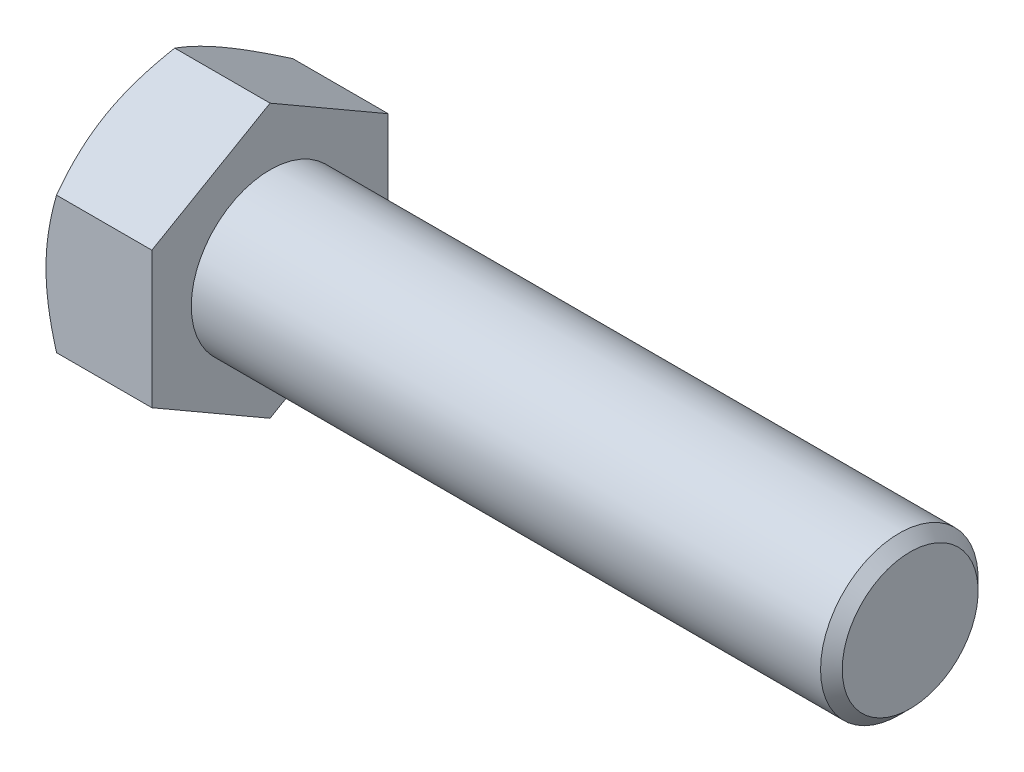
ISO-10303-21;
HEADER;
FILE_DESCRIPTION(('STEP AP214'),'2;1');
FILE_NAME('part.step','',(''),(''),'','','');
FILE_SCHEMA(('AUTOMOTIVE_DESIGN { 1 0 10303 214 1 1 1 1 }'));
ENDSEC;
DATA;
#1=APPLICATION_CONTEXT('core data for automotive mechanical design processes');
#2=APPLICATION_PROTOCOL_DEFINITION('international standard','automotive_design',2000,#1);
#3=PRODUCT_CONTEXT('',#1,'mechanical');
#4=PRODUCT('Part','Part','',(#3));
#5=PRODUCT_RELATED_PRODUCT_CATEGORY('part','',(#4));
#6=PRODUCT_DEFINITION_FORMATION('','',#4);
#7=PRODUCT_DEFINITION_CONTEXT('part definition',#1,'design');
#8=PRODUCT_DEFINITION('design','',#6,#7);
#9=PRODUCT_DEFINITION_SHAPE('','',#8);
#10=(LENGTH_UNIT() NAMED_UNIT(*) SI_UNIT(.MILLI.,.METRE.));
#11=(NAMED_UNIT(*) PLANE_ANGLE_UNIT() SI_UNIT($,.RADIAN.));
#12=(NAMED_UNIT(*) SI_UNIT($,.STERADIAN.) SOLID_ANGLE_UNIT());
#13=UNCERTAINTY_MEASURE_WITH_UNIT(LENGTH_MEASURE(1.E-05),#10,'distance_accuracy_value','');
#14=(GEOMETRIC_REPRESENTATION_CONTEXT(3) GLOBAL_UNCERTAINTY_ASSIGNED_CONTEXT((#13)) GLOBAL_UNIT_ASSIGNED_CONTEXT((#10,
#11,#12)) REPRESENTATION_CONTEXT('',''));
#15=CARTESIAN_POINT('',(0.,0.,0.));
#16=DIRECTION('',(0.,0.,1.));
#17=DIRECTION('',(1.,0.,0.));
#18=AXIS2_PLACEMENT_3D('',#15,#16,#17);
#19=CARTESIAN_POINT('',(0.,13.856406460551,0.));
#20=DIRECTION('',(1.,0.,0.));
#21=DIRECTION('',(0.,0.,-1.));
#22=AXIS2_PLACEMENT_3D('',#19,#20,#21);
#23=PLANE('',#22);
#24=CARTESIAN_POINT('',(0.,0.,0.));
#25=DIRECTION('',(1.,0.,0.));
#26=DIRECTION('',(0.,0.,-1.));
#27=AXIS2_PLACEMENT_3D('',#24,#25,#26);
#28=CIRCLE('',#27,12.);
#29=CARTESIAN_POINT('',(0.,-10.3923048454133,-6.));
#30=VERTEX_POINT('',#29);
#31=CARTESIAN_POINT('',(0.,0.,-12.));
#32=VERTEX_POINT('',#31);
#33=EDGE_CURVE('E328',#30,#32,#28,.T.);
#34=ORIENTED_EDGE('',*,*,#33,.F.);
#35=CARTESIAN_POINT('',(0.,0.,0.));
#36=DIRECTION('',(1.,0.,0.));
#37=DIRECTION('',(0.,0.,-1.));
#38=AXIS2_PLACEMENT_3D('',#35,#36,#37);
#39=CIRCLE('',#38,12.);
#40=CARTESIAN_POINT('',(0.,-10.3923048454132,6.00000000000003));
#41=VERTEX_POINT('',#40);
#42=EDGE_CURVE('E327',#41,#30,#39,.T.);
#43=ORIENTED_EDGE('',*,*,#42,.F.);
#44=CARTESIAN_POINT('',(0.,0.,0.));
#45=DIRECTION('',(1.,0.,0.));
#46=DIRECTION('',(0.,0.,-1.));
#47=AXIS2_PLACEMENT_3D('',#44,#45,#46);
#48=CIRCLE('',#47,12.);
#49=CARTESIAN_POINT('',(0.,0.,12.));
#50=VERTEX_POINT('',#49);
#51=EDGE_CURVE('E89',#50,#41,#48,.T.);
#52=ORIENTED_EDGE('',*,*,#51,.F.);
#53=CARTESIAN_POINT('',(0.,0.,0.));
#54=DIRECTION('',(1.,0.,0.));
#55=DIRECTION('',(0.,0.,-1.));
#56=AXIS2_PLACEMENT_3D('',#53,#54,#55);
#57=CIRCLE('',#56,12.);
#58=CARTESIAN_POINT('',(0.,10.3923048454133,6.00000000000001));
#59=VERTEX_POINT('',#58);
#60=EDGE_CURVE('E87',#59,#50,#57,.T.);
#61=ORIENTED_EDGE('',*,*,#60,.F.);
#62=CARTESIAN_POINT('',(0.,0.,0.));
#63=DIRECTION('',(1.,0.,0.));
#64=DIRECTION('',(0.,0.,-1.));
#65=AXIS2_PLACEMENT_3D('',#62,#63,#64);
#66=CIRCLE('',#65,12.);
#67=CARTESIAN_POINT('',(0.,10.3923048454133,-6.00000000000001));
#68=VERTEX_POINT('',#67);
#69=EDGE_CURVE('E20',#68,#59,#66,.T.);
#70=ORIENTED_EDGE('',*,*,#69,.F.);
#71=CARTESIAN_POINT('',(0.,0.,0.));
#72=DIRECTION('',(1.,0.,0.));
#73=DIRECTION('',(0.,0.,-1.));
#74=AXIS2_PLACEMENT_3D('',#71,#72,#73);
#75=CIRCLE('',#74,12.);
#76=EDGE_CURVE('E255',#32,#68,#75,.T.);
#77=ORIENTED_EDGE('',*,*,#76,.F.);
#78=EDGE_LOOP('',(#34,#43,#52,#61,#70,#77));
#79=FACE_BOUND('',#78,.T.);
#80=ADVANCED_FACE('F17',(#79),#23,.F.);
#81=CARTESIAN_POINT('',(1.07822755034284,0.,0.));
#82=DIRECTION('',(1.,0.,0.));
#83=DIRECTION('',(0.,0.,-1.));
#84=AXIS2_PLACEMENT_3D('',#81,#82,#83);
#85=CONICAL_SURFACE('',#84,13.8675448993143,1.0471975511966);
#86=CARTESIAN_POINT('',(1.07179676972449,13.856406460551,0.));
#87=CARTESIAN_POINT('',(0.908940799911312,13.5743006175821,-0.488621653134199));
#88=CARTESIAN_POINT('',(0.759755266933871,13.2901242461885,-0.980829566698534));
#89=CARTESIAN_POINT('',(0.562274952239644,12.8616146811394,-1.72302990489287));
#90=CARTESIAN_POINT('',(0.50095006831841,12.7187583400199,-1.97046434589519));
#91=CARTESIAN_POINT('',(0.387776318757365,12.4321091330912,-2.46695533624495));
#92=CARTESIAN_POINT('',(0.335926875709029,12.2883163249013,-2.71601178579294));
#93=CARTESIAN_POINT('',(0.242530246242278,11.9997152642606,-3.21588348594086));
#94=CARTESIAN_POINT('',(0.200995561015241,11.8549059962408,-3.46670049555793));
#95=CARTESIAN_POINT('',(0.129101019121795,11.5645948484026,-3.96953415361745));
#96=CARTESIAN_POINT('',(0.0987408683331393,11.4190929869158,-4.22155077030845));
#97=CARTESIAN_POINT('',(0.0497242910385115,11.1268576505267,-4.72771722070131));
#98=CARTESIAN_POINT('',(0.0311273829961276,10.9801216596432,-4.98187141221056));
#99=CARTESIAN_POINT('',(0.00623934431726279,10.6863610957437,-5.49067963414449));
#100=CARTESIAN_POINT('',(-4.93491989073702E-05,10.539336471344,-5.74533375356847));
#101=CARTESIAN_POINT('',(0.,10.3923048454133,-6.00000000000001));
#102=B_SPLINE_CURVE_WITH_KNOTS('',3,(#86,#87,#88,#89,#90,#91,#92,#93,#94,#95,#96,#97,#98,#99,
#100,#101),.UNSPECIFIED.,.F.,.F.,(4,2,2,2,2,2,2,4),(0.,1.76168798013763,2.63822760396066,
3.5147137959332,4.39225713601218,5.26977737683081,6.15170281893047,7.03380287133137),.UNSPECIFIED.);
#103=CARTESIAN_POINT('',(1.07179676972449,13.856406460551,0.));
#104=VERTEX_POINT('',#103);
#105=EDGE_CURVE('E99',#104,#68,#102,.T.);
#106=ORIENTED_EDGE('',*,*,#105,.T.);
#107=ORIENTED_EDGE('',*,*,#69,.T.);
#108=CARTESIAN_POINT('',(0.,10.3923048454133,6.00000000000001));
#109=CARTESIAN_POINT('',(-4.93491989066502E-05,10.539336471344,5.74533375356847));
#110=CARTESIAN_POINT('',(0.00623934431726331,10.6863610957437,5.49067963414449));
#111=CARTESIAN_POINT('',(0.0311273829961284,10.9801216596432,4.98187141221056));
#112=CARTESIAN_POINT('',(0.0497242910385127,11.1268576505267,4.72771722070131));
#113=CARTESIAN_POINT('',(0.0987408683331407,11.4190929869158,4.22155077030845));
#114=CARTESIAN_POINT('',(0.129101019121797,11.5645948484026,3.96953415361745));
#115=CARTESIAN_POINT('',(0.200995561015241,11.8549059962408,3.46670049555793));
#116=CARTESIAN_POINT('',(0.242530246242278,11.9997152642606,3.21588348594086));
#117=CARTESIAN_POINT('',(0.33592687570903,12.2883163249013,2.71601178579294));
#118=CARTESIAN_POINT('',(0.387776318757366,12.4321091330912,2.46695533624495));
#119=CARTESIAN_POINT('',(0.500950068318412,12.7187583400199,1.97046434589519));
#120=CARTESIAN_POINT('',(0.562274952239646,12.8616146811394,1.72302990489287));
#121=CARTESIAN_POINT('',(0.75975526693387,13.2901242461885,0.980829566698535));
#122=CARTESIAN_POINT('',(0.90894079991131,13.5743006175821,0.4886216531342));
#123=CARTESIAN_POINT('',(1.07179676972449,13.856406460551,0.));
#124=B_SPLINE_CURVE_WITH_KNOTS('',3,(#108,#109,#110,#111,#112,#113,#114,#115,#116,#117,#118,
#119,#120,#121,#122,#123),.UNSPECIFIED.,.F.,.F.,(4,2,2,2,2,2,2,4),(0.,0.882100052400904,
1.76402549450056,2.64154573531919,3.51908907539817,4.39557526737071,5.27211489119374,
7.03380287133137),.UNSPECIFIED.);
#125=EDGE_CURVE('E97',#59,#104,#124,.T.);
#126=ORIENTED_EDGE('',*,*,#125,.T.);
#127=EDGE_LOOP('',(#106,#107,#126));
#128=FACE_BOUND('',#127,.T.);
#129=ADVANCED_FACE('F95',(#128),#85,.T.);
#130=CARTESIAN_POINT('',(1.07822755034283,0.,0.));
#131=DIRECTION('',(1.,0.,0.));
#132=DIRECTION('',(0.,0.,-1.));
#133=AXIS2_PLACEMENT_3D('',#130,#131,#132);
#134=CONICAL_SURFACE('',#133,13.8675448993143,1.0471975511966);
#135=CARTESIAN_POINT('',(1.07179676972448,6.9282032302755,12.));
#136=CARTESIAN_POINT('',(0.908940799911304,7.21030907324441,11.5113783468658));
#137=CARTESIAN_POINT('',(0.759755266933865,7.49448544463804,11.0191704333015));
#138=CARTESIAN_POINT('',(0.562274952239641,7.92299500968717,10.2769700951071));
#139=CARTESIAN_POINT('',(0.500950068318407,8.06585135080665,10.0295356541048));
#140=CARTESIAN_POINT('',(0.387776318757363,8.3525005577353,9.53304466375506));
#141=CARTESIAN_POINT('',(0.335926875709027,8.49629336592525,9.28398821420708));
#142=CARTESIAN_POINT('',(0.242530246242276,8.78489442656593,8.78411651405915));
#143=CARTESIAN_POINT('',(0.200995561015239,8.92970369458568,8.53329950444208));
#144=CARTESIAN_POINT('',(0.129101019121795,9.22001484242395,8.03046584638256));
#145=CARTESIAN_POINT('',(0.0987408683331404,9.36551670391075,7.77844922969157));
#146=CARTESIAN_POINT('',(0.0497242910385134,9.65775204029983,7.27228277929871));
#147=CARTESIAN_POINT('',(0.0311273829961288,9.80448803118336,7.01812858778946));
#148=CARTESIAN_POINT('',(0.00623934431726292,10.0982485950828,6.50932036585553));
#149=CARTESIAN_POINT('',(-4.93491989074931E-05,10.2452732194825,6.25466624643155));
#150=CARTESIAN_POINT('',(0.,10.3923048454133,6.00000000000001));
#151=B_SPLINE_CURVE_WITH_KNOTS('',3,(#135,#136,#137,#138,#139,#140,#141,#142,#143,#144,#145,
#146,#147,#148,#149,#150),.UNSPECIFIED.,.F.,.F.,(4,2,2,2,2,2,2,4),(0.,1.76168798013762,
2.63822760396065,3.51471379593319,4.39225713601216,5.26977737683078,6.15170281893044,
7.03380287133134),.UNSPECIFIED.);
#152=CARTESIAN_POINT('',(1.07179676972448,6.9282032302755,12.));
#153=VERTEX_POINT('',#152);
#154=EDGE_CURVE('E102',#153,#59,#151,.T.);
#155=ORIENTED_EDGE('',*,*,#154,.T.);
#156=ORIENTED_EDGE('',*,*,#60,.T.);
#157=CARTESIAN_POINT('',(0.,0.,12.));
#158=CARTESIAN_POINT('',(-4.93491989069261E-05,0.294063251861521,12.));
#159=CARTESIAN_POINT('',(0.00623934431726302,0.588112500660887,12.));
#160=CARTESIAN_POINT('',(0.0311273829961276,1.17563362845979,12.));
#161=CARTESIAN_POINT('',(0.0497242910385114,1.46910561022685,12.));
#162=CARTESIAN_POINT('',(0.0987408683331387,2.05357628300501,12.));
#163=CARTESIAN_POINT('',(0.129101019121794,2.34458000597862,12.));
#164=CARTESIAN_POINT('',(0.200995561015239,2.92520230165515,12.));
#165=CARTESIAN_POINT('',(0.242530246242275,3.21482083769466,12.));
#166=CARTESIAN_POINT('',(0.335926875709026,3.79202295897601,12.));
#167=CARTESIAN_POINT('',(0.387776318757362,4.0796085753559,12.));
#168=CARTESIAN_POINT('',(0.500950068318406,4.65290698921321,12.));
#169=CARTESIAN_POINT('',(0.56227495223964,4.93861967145216,12.));
#170=CARTESIAN_POINT('',(0.759755266933863,5.79563880155042,12.));
#171=CARTESIAN_POINT('',(0.908940799911302,6.36399154433768,12.));
#172=CARTESIAN_POINT('',(1.07179676972448,6.9282032302755,12.));
#173=B_SPLINE_CURVE_WITH_KNOTS('',3,(#157,#158,#159,#160,#161,#162,#163,#164,#165,#166,#167,
#168,#169,#170,#171,#172),.UNSPECIFIED.,.F.,.F.,(4,2,2,2,2,2,2,4),(0.,0.8821000524009,
1.76402549450056,2.64154573531918,3.51908907539815,4.39557526737069,5.27211489119372,
7.03380287133134),.UNSPECIFIED.);
#174=EDGE_CURVE('E105',#50,#153,#173,.T.);
#175=ORIENTED_EDGE('',*,*,#174,.T.);
#176=EDGE_LOOP('',(#155,#156,#175));
#177=FACE_BOUND('',#176,.T.);
#178=ADVANCED_FACE('F103',(#177),#134,.T.);
#179=CARTESIAN_POINT('',(1.07822755034282,0.,0.));
#180=DIRECTION('',(1.,0.,0.));
#181=DIRECTION('',(0.,0.,-1.));
#182=AXIS2_PLACEMENT_3D('',#179,#180,#181);
#183=CONICAL_SURFACE('',#182,13.8675448993143,1.0471975511966);
#184=ORIENTED_EDGE('',*,*,#51,.T.);
#185=CARTESIAN_POINT('',(0.,-10.3923048454132,6.00000000000002));
#186=CARTESIAN_POINT('',(-4.93491989117504E-05,-10.2452732194825,6.25466624643156));
#187=CARTESIAN_POINT('',(0.0062393443172584,-10.0982485950828,6.50932036585554));
#188=CARTESIAN_POINT('',(0.0311273829961234,-9.80448803118335,7.01812858778947));
#189=CARTESIAN_POINT('',(0.0497242910385074,-9.65775204029981,7.27228277929872));
#190=CARTESIAN_POINT('',(0.0987408683331346,-9.36551670391073,7.77844922969158));
#191=CARTESIAN_POINT('',(0.12910101912179,-9.22001484242393,8.03046584638257));
#192=CARTESIAN_POINT('',(0.200995561015234,-8.92970369458566,8.53329950444209));
#193=CARTESIAN_POINT('',(0.242530246242271,-8.78489442656591,8.78411651405916));
#194=CARTESIAN_POINT('',(0.335926875709021,-8.49629336592523,9.28398821420708));
#195=CARTESIAN_POINT('',(0.387776318757357,-8.35250055773529,9.53304466375507));
#196=CARTESIAN_POINT('',(0.500950068318402,-8.06585135080663,10.0295356541048));
#197=CARTESIAN_POINT('',(0.562274952239635,-7.92299500968716,10.2769700951071));
#198=CARTESIAN_POINT('',(0.759755266933859,-7.49448544463803,11.0191704333015));
#199=CARTESIAN_POINT('',(0.908940799911297,-7.21030907324439,11.5113783468658));
#200=CARTESIAN_POINT('',(1.07179676972448,-6.92820323027548,12.));
#201=B_SPLINE_CURVE_WITH_KNOTS('',3,(#185,#186,#187,#188,#189,#190,#191,#192,#193,#194,#195,
#196,#197,#198,#199,#200),.UNSPECIFIED.,.F.,.F.,(4,2,2,2,2,2,2,4),(0.,0.882100052400899,
1.76402549450056,2.64154573531917,3.51908907539815,4.39557526737069,5.27211489119371,
7.03380287133133),.UNSPECIFIED.);
#202=CARTESIAN_POINT('',(1.07179676972448,-6.92820323027548,12.));
#203=VERTEX_POINT('',#202);
#204=EDGE_CURVE('E174',#41,#203,#201,.T.);
#205=ORIENTED_EDGE('',*,*,#204,.T.);
#206=CARTESIAN_POINT('',(1.07179676972448,-6.92820323027548,12.));
#207=CARTESIAN_POINT('',(0.908940799911296,-6.36399154433767,12.));
#208=CARTESIAN_POINT('',(0.759755266933858,-5.7956388015504,12.));
#209=CARTESIAN_POINT('',(0.562274952239637,-4.93861967145214,12.));
#210=CARTESIAN_POINT('',(0.500950068318404,-4.65290698921319,12.));
#211=CARTESIAN_POINT('',(0.38777631875736,-4.07960857535589,12.));
#212=CARTESIAN_POINT('',(0.335926875709024,-3.792022958976,12.));
#213=CARTESIAN_POINT('',(0.242530246242274,-3.21482083769465,12.));
#214=CARTESIAN_POINT('',(0.200995561015237,-2.92520230165514,12.));
#215=CARTESIAN_POINT('',(0.129101019121794,-2.34458000597861,12.));
#216=CARTESIAN_POINT('',(0.0987408683331384,-2.053576283005,12.));
#217=CARTESIAN_POINT('',(0.0497242910385114,-1.46910561022685,12.));
#218=CARTESIAN_POINT('',(0.0311273829961276,-1.17563362845978,12.));
#219=CARTESIAN_POINT('',(0.00623934431726295,-0.588112500660885,12.));
#220=CARTESIAN_POINT('',(-4.93491989070643E-05,-0.294063251861519,12.));
#221=CARTESIAN_POINT('',(0.,0.,12.));
#222=B_SPLINE_CURVE_WITH_KNOTS('',3,(#206,#207,#208,#209,#210,#211,#212,#213,#214,#215,#216,
#217,#218,#219,#220,#221),.UNSPECIFIED.,.F.,.F.,(4,2,2,2,2,2,2,4),(0.,1.76168798013762,
2.63822760396064,3.51471379593318,4.39225713601215,5.26977737683077,6.15170281893042,
7.03380287133132),.UNSPECIFIED.);
#223=EDGE_CURVE('E148',#203,#50,#222,.T.);
#224=ORIENTED_EDGE('',*,*,#223,.T.);
#225=EDGE_LOOP('',(#184,#205,#224));
#226=FACE_BOUND('',#225,.T.);
#227=ADVANCED_FACE('F139',(#226),#183,.T.);
#228=CARTESIAN_POINT('',(1.07822755034284,0.,0.));
#229=DIRECTION('',(1.,0.,0.));
#230=DIRECTION('',(0.,0.,-1.));
#231=AXIS2_PLACEMENT_3D('',#228,#229,#230);
#232=CONICAL_SURFACE('',#231,13.8675448993143,1.0471975511966);
#233=ORIENTED_EDGE('',*,*,#42,.T.);
#234=CARTESIAN_POINT('',(0.,-10.3923048454133,-6.));
#235=CARTESIAN_POINT('',(-4.93491989009927E-05,-10.539336471344,-5.74533375356846));
#236=CARTESIAN_POINT('',(0.00623934431726868,-10.6863610957437,-5.49067963414448));
#237=CARTESIAN_POINT('',(0.0311273829961334,-10.9801216596432,-4.98187141221055));
#238=CARTESIAN_POINT('',(0.0497242910385177,-11.1268576505267,-4.7277172207013));
#239=CARTESIAN_POINT('',(0.0987408683331454,-11.4190929869158,-4.22155077030844));
#240=CARTESIAN_POINT('',(0.129101019121801,-11.5645948484026,-3.96953415361744));
#241=CARTESIAN_POINT('',(0.200995561015246,-11.8549059962409,-3.46670049555793));
#242=CARTESIAN_POINT('',(0.242530246242283,-11.9997152642606,-3.21588348594086));
#243=CARTESIAN_POINT('',(0.335926875709034,-12.2883163249013,-2.71601178579293));
#244=CARTESIAN_POINT('',(0.387776318757369,-12.4321091330912,-2.46695533624494));
#245=CARTESIAN_POINT('',(0.500950068318413,-12.7187583400199,-1.97046434589519));
#246=CARTESIAN_POINT('',(0.562274952239647,-12.8616146811394,-1.72302990489287));
#247=CARTESIAN_POINT('',(0.759755266933871,-13.2901242461885,-0.980829566698532));
#248=CARTESIAN_POINT('',(0.908940799911311,-13.5743006175821,-0.488621653134199));
#249=CARTESIAN_POINT('',(1.07179676972449,-13.856406460551,0.));
#250=B_SPLINE_CURVE_WITH_KNOTS('',3,(#234,#235,#236,#237,#238,#239,#240,#241,#242,#243,#244,
#245,#246,#247,#248,#249),.UNSPECIFIED.,.F.,.F.,(4,2,2,2,2,2,2,4),(0.,0.882100052400901,
1.76402549450056,2.64154573531918,3.51908907539816,4.3955752673707,5.27211489119373,
7.03380287133135),.UNSPECIFIED.);
#251=CARTESIAN_POINT('',(1.07179676972449,-13.856406460551,0.));
#252=VERTEX_POINT('',#251);
#253=EDGE_CURVE('E302',#30,#252,#250,.T.);
#254=ORIENTED_EDGE('',*,*,#253,.T.);
#255=CARTESIAN_POINT('',(1.07179676972449,-13.856406460551,0.));
#256=CARTESIAN_POINT('',(0.908940799911309,-13.5743006175821,0.488621653134199));
#257=CARTESIAN_POINT('',(0.759755266933868,-13.2901242461885,0.980829566698536));
#258=CARTESIAN_POINT('',(0.562274952239642,-12.8616146811393,1.72302990489287));
#259=CARTESIAN_POINT('',(0.500950068318407,-12.7187583400199,1.9704643458952));
#260=CARTESIAN_POINT('',(0.387776318757362,-12.4321091330912,2.46695533624495));
#261=CARTESIAN_POINT('',(0.335926875709026,-12.2883163249013,2.71601178579294));
#262=CARTESIAN_POINT('',(0.242530246242274,-11.9997152642606,3.21588348594087));
#263=CARTESIAN_POINT('',(0.200995561015236,-11.8549059962408,3.46670049555794));
#264=CARTESIAN_POINT('',(0.129101019121791,-11.5645948484026,3.96953415361746));
#265=CARTESIAN_POINT('',(0.0987408683331354,-11.4190929869158,4.22155077030845));
#266=CARTESIAN_POINT('',(0.0497242910385074,-11.1268576505267,4.72771722070132));
#267=CARTESIAN_POINT('',(0.0311273829961229,-10.9801216596431,4.98187141221057));
#268=CARTESIAN_POINT('',(0.00623934431725752,-10.6863610957437,5.4906796341445));
#269=CARTESIAN_POINT('',(-4.93491989125699E-05,-10.539336471344,5.74533375356848));
#270=CARTESIAN_POINT('',(0.,-10.3923048454132,6.00000000000002));
#271=B_SPLINE_CURVE_WITH_KNOTS('',3,(#255,#256,#257,#258,#259,#260,#261,#262,#263,#264,#265,
#266,#267,#268,#269,#270),.UNSPECIFIED.,.F.,.F.,(4,2,2,2,2,2,2,4),(0.,1.76168798013763,
2.63822760396067,3.51471379593321,4.39225713601219,5.26977737683082,6.15170281893048,
7.03380287133139),.UNSPECIFIED.);
#272=EDGE_CURVE('E169',#252,#41,#271,.T.);
#273=ORIENTED_EDGE('',*,*,#272,.T.);
#274=EDGE_LOOP('',(#233,#254,#273));
#275=FACE_BOUND('',#274,.T.);
#276=ADVANCED_FACE('F318',(#275),#232,.T.);
#277=CARTESIAN_POINT('',(1.07822755034284,0.,0.));
#278=DIRECTION('',(1.,0.,0.));
#279=DIRECTION('',(0.,0.,-1.));
#280=AXIS2_PLACEMENT_3D('',#277,#278,#279);
#281=CONICAL_SURFACE('',#280,13.8675448993143,1.0471975511966);
#282=ORIENTED_EDGE('',*,*,#33,.T.);
#283=CARTESIAN_POINT('',(0.,0.,-12.));
#284=CARTESIAN_POINT('',(-4.93491989065095E-05,-0.29406325186152,-12.));
#285=CARTESIAN_POINT('',(0.0062393443172637,-0.588112500660888,-12.));
#286=CARTESIAN_POINT('',(0.0311273829961291,-1.17563362845979,-12.));
#287=CARTESIAN_POINT('',(0.0497242910385135,-1.46910561022686,-12.));
#288=CARTESIAN_POINT('',(0.0987408683331413,-2.05357628300501,-12.));
#289=CARTESIAN_POINT('',(0.129101019121797,-2.34458000597862,-12.));
#290=CARTESIAN_POINT('',(0.200995561015241,-2.92520230165516,-12.));
#291=CARTESIAN_POINT('',(0.242530246242278,-3.21482083769466,-12.));
#292=CARTESIAN_POINT('',(0.335926875709029,-3.79202295897603,-12.));
#293=CARTESIAN_POINT('',(0.387776318757366,-4.07960857535591,-12.));
#294=CARTESIAN_POINT('',(0.500950068318411,-4.65290698921322,-12.));
#295=CARTESIAN_POINT('',(0.562274952239645,-4.93861967145217,-12.));
#296=CARTESIAN_POINT('',(0.759755266933869,-5.79563880155044,-12.));
#297=CARTESIAN_POINT('',(0.908940799911307,-6.3639915443377,-12.));
#298=CARTESIAN_POINT('',(1.07179676972449,-6.92820323027552,-12.));
#299=B_SPLINE_CURVE_WITH_KNOTS('',3,(#283,#284,#285,#286,#287,#288,#289,#290,#291,#292,#293,
#294,#295,#296,#297,#298),.UNSPECIFIED.,.F.,.F.,(4,2,2,2,2,2,2,4),(0.,0.882100052400902,
1.76402549450056,2.64154573531919,3.51908907539816,4.39557526737071,5.27211489119374,
7.03380287133136),.UNSPECIFIED.);
#300=CARTESIAN_POINT('',(1.07179676972449,-6.92820323027552,-12.));
#301=VERTEX_POINT('',#300);
#302=EDGE_CURVE('E233',#32,#301,#299,.T.);
#303=ORIENTED_EDGE('',*,*,#302,.T.);
#304=CARTESIAN_POINT('',(1.07179676972449,-6.92820323027552,-12.));
#305=CARTESIAN_POINT('',(0.90894079991131,-7.21030907324443,-11.5113783468658));
#306=CARTESIAN_POINT('',(0.759755266933871,-7.49448544463806,-11.0191704333015));
#307=CARTESIAN_POINT('',(0.562274952239647,-7.92299500968719,-10.2769700951071));
#308=CARTESIAN_POINT('',(0.500950068318414,-8.06585135080667,-10.0295356541048));
#309=CARTESIAN_POINT('',(0.387776318757369,-8.35250055773532,-9.53304466375506));
#310=CARTESIAN_POINT('',(0.335926875709033,-8.49629336592527,-9.28398821420707));
#311=CARTESIAN_POINT('',(0.242530246242282,-8.78489442656595,-8.78411651405915));
#312=CARTESIAN_POINT('',(0.200995561015244,-8.9297036945857,-8.53329950444208));
#313=CARTESIAN_POINT('',(0.1291010191218,-9.22001484242397,-8.03046584638256));
#314=CARTESIAN_POINT('',(0.0987408683331441,-9.36551670391077,-7.77844922969156));
#315=CARTESIAN_POINT('',(0.049724291038517,-9.65775204029985,-7.2722827792987));
#316=CARTESIAN_POINT('',(0.0311273829961332,-9.80448803118338,-7.01812858778945));
#317=CARTESIAN_POINT('',(0.00623934431726868,-10.0982485950828,-6.50932036585552));
#318=CARTESIAN_POINT('',(-4.93491989013492E-05,-10.2452732194825,-6.25466624643154));
#319=CARTESIAN_POINT('',(0.,-10.3923048454133,-6.));
#320=B_SPLINE_CURVE_WITH_KNOTS('',3,(#304,#305,#306,#307,#308,#309,#310,#311,#312,#313,#314,
#315,#316,#317,#318,#319),.UNSPECIFIED.,.F.,.F.,(4,2,2,2,2,2,2,4),(0.,1.76168798013762,
2.63822760396065,3.51471379593319,4.39225713601217,5.26977737683079,6.15170281893045,
7.03380287133135),.UNSPECIFIED.);
#321=EDGE_CURVE('E301',#301,#30,#320,.T.);
#322=ORIENTED_EDGE('',*,*,#321,.T.);
#323=EDGE_LOOP('',(#282,#303,#322));
#324=FACE_BOUND('',#323,.T.);
#325=ADVANCED_FACE('F247',(#324),#281,.T.);
#326=CARTESIAN_POINT('',(1.07822755034283,0.,0.));
#327=DIRECTION('',(1.,0.,0.));
#328=DIRECTION('',(0.,0.,-1.));
#329=AXIS2_PLACEMENT_3D('',#326,#327,#328);
#330=CONICAL_SURFACE('',#329,13.8675448993143,1.0471975511966);
#331=CARTESIAN_POINT('',(1.07179676972448,6.9282032302755,-12.));
#332=CARTESIAN_POINT('',(0.908940799911301,6.36399154433768,-12.));
#333=CARTESIAN_POINT('',(0.759755266933862,5.79563880155042,-12.));
#334=CARTESIAN_POINT('',(0.56227495223964,4.93861967145216,-12.));
#335=CARTESIAN_POINT('',(0.500950068318406,4.65290698921321,-12.));
#336=CARTESIAN_POINT('',(0.387776318757363,4.0796085753559,-12.));
#337=CARTESIAN_POINT('',(0.335926875709027,3.79202295897601,-12.));
#338=CARTESIAN_POINT('',(0.242530246242276,3.21482083769466,-12.));
#339=CARTESIAN_POINT('',(0.200995561015239,2.92520230165515,-12.));
#340=CARTESIAN_POINT('',(0.129101019121795,2.34458000597862,-12.));
#341=CARTESIAN_POINT('',(0.0987408683331403,2.05357628300501,-12.));
#342=CARTESIAN_POINT('',(0.0497242910385132,1.46910561022685,-12.));
#343=CARTESIAN_POINT('',(0.0311273829961288,1.17563362845979,-12.));
#344=CARTESIAN_POINT('',(0.00623934431726341,0.588112500660889,-12.));
#345=CARTESIAN_POINT('',(-4.93491989068206E-05,0.294063251861522,-12.));
#346=CARTESIAN_POINT('',(0.,0.,-12.));
#347=B_SPLINE_CURVE_WITH_KNOTS('',3,(#331,#332,#333,#334,#335,#336,#337,#338,#339,#340,#341,
#342,#343,#344,#345,#346),.UNSPECIFIED.,.F.,.F.,(4,2,2,2,2,2,2,4),(0.,1.76168798013762,
2.63822760396065,3.51471379593319,4.39225713601216,5.26977737683078,6.15170281893044,
7.03380287133134),.UNSPECIFIED.);
#348=CARTESIAN_POINT('',(1.07179676972448,6.9282032302755,-12.));
#349=VERTEX_POINT('',#348);
#350=EDGE_CURVE('E225',#349,#32,#347,.T.);
#351=ORIENTED_EDGE('',*,*,#350,.T.);
#352=ORIENTED_EDGE('',*,*,#76,.T.);
#353=CARTESIAN_POINT('',(0.,10.3923048454133,-6.00000000000001));
#354=CARTESIAN_POINT('',(-4.93491989083239E-05,10.2452732194825,-6.25466624643155));
#355=CARTESIAN_POINT('',(0.00623934431726153,10.0982485950828,-6.50932036585553));
#356=CARTESIAN_POINT('',(0.0311273829961267,9.80448803118336,-7.01812858778946));
#357=CARTESIAN_POINT('',(0.0497242910385112,9.65775204029983,-7.27228277929871));
#358=CARTESIAN_POINT('',(0.0987408683331387,9.36551670391075,-7.77844922969157));
#359=CARTESIAN_POINT('',(0.129101019121794,9.22001484242394,-8.03046584638257));
#360=CARTESIAN_POINT('',(0.200995561015238,8.92970369458568,-8.53329950444208));
#361=CARTESIAN_POINT('',(0.242530246242275,8.78489442656593,-8.78411651405915));
#362=CARTESIAN_POINT('',(0.335926875709026,8.49629336592524,-9.28398821420707));
#363=CARTESIAN_POINT('',(0.387776318757361,8.3525005577353,-9.53304466375506));
#364=CARTESIAN_POINT('',(0.500950068318406,8.06585135080665,-10.0295356541048));
#365=CARTESIAN_POINT('',(0.56227495223964,7.92299500968717,-10.2769700951071));
#366=CARTESIAN_POINT('',(0.759755266933864,7.49448544463804,-11.0191704333015));
#367=CARTESIAN_POINT('',(0.908940799911304,7.21030907324441,-11.5113783468658));
#368=CARTESIAN_POINT('',(1.07179676972448,6.9282032302755,-12.));
#369=B_SPLINE_CURVE_WITH_KNOTS('',3,(#353,#354,#355,#356,#357,#358,#359,#360,#361,#362,#363,
#364,#365,#366,#367,#368),.UNSPECIFIED.,.F.,.F.,(4,2,2,2,2,2,2,4),(0.,0.8821000524009,
1.76402549450056,2.64154573531918,3.51908907539815,4.39557526737069,5.27211489119372,
7.03380287133134),.UNSPECIFIED.);
#370=EDGE_CURVE('E115',#68,#349,#369,.T.);
#371=ORIENTED_EDGE('',*,*,#370,.T.);
#372=EDGE_LOOP('',(#351,#352,#371));
#373=FACE_BOUND('',#372,.T.);
#374=ADVANCED_FACE('F242',(#373),#330,.T.);
#375=CARTESIAN_POINT('',(75.75,0.,0.));
#376=DIRECTION('',(-1.,0.,0.));
#377=DIRECTION('',(0.,0.,1.));
#378=AXIS2_PLACEMENT_3D('',#375,#376,#377);
#379=PLANE('',#378);
#380=CARTESIAN_POINT('',(75.7499999999709,0.,0.));
#381=DIRECTION('',(-1.,0.,0.));
#382=DIRECTION('',(0.,0.,1.));
#383=AXIS2_PLACEMENT_3D('',#380,#381,#382);
#384=CIRCLE('',#383,6.89850000003389);
#385=CARTESIAN_POINT('',(75.7499999999709,0.,6.89850000003389));
#386=VERTEX_POINT('',#385);
#387=EDGE_CURVE('E196',#386,#386,#384,.T.);
#388=ORIENTED_EDGE('',*,*,#387,.F.);
#389=EDGE_LOOP('',(#388));
#390=FACE_BOUND('',#389,.T.);
#391=ADVANCED_FACE('F246',(#390),#379,.F.);
#392=CARTESIAN_POINT('',(10.75,6.9282032302755,-12.));
#393=DIRECTION('',(0.,-0.866025403784438,0.500000000000001));
#394=DIRECTION('',(0.,-0.500000000000001,-0.866025403784438));
#395=AXIS2_PLACEMENT_3D('',#392,#393,#394);
#396=PLANE('',#395);
#397=DIRECTION('',(1.,0.,0.));
#398=VECTOR('',#397,1.);
#399=CARTESIAN_POINT('',(10.75,13.856406460551,0.));
#400=LINE('',#399,#398);
#401=CARTESIAN_POINT('',(10.75,13.856406460551,0.));
#402=VERTEX_POINT('',#401);
#403=EDGE_CURVE('E108',#104,#402,#400,.T.);
#404=ORIENTED_EDGE('',*,*,#403,.T.);
#405=DIRECTION('',(0.,0.500000000000001,0.866025403784438));
#406=VECTOR('',#405,1.);
#407=CARTESIAN_POINT('',(10.75,6.9282032302755,-12.));
#408=LINE('',#407,#406);
#409=CARTESIAN_POINT('',(10.75,6.9282032302755,-12.));
#410=VERTEX_POINT('',#409);
#411=EDGE_CURVE('E192',#410,#402,#408,.T.);
#412=ORIENTED_EDGE('',*,*,#411,.F.);
#413=DIRECTION('',(1.,0.,0.));
#414=VECTOR('',#413,1.);
#415=CARTESIAN_POINT('',(10.75,6.9282032302755,-12.));
#416=LINE('',#415,#414);
#417=EDGE_CURVE('E232',#410,#349,#416,.F.);
#418=ORIENTED_EDGE('',*,*,#417,.T.);
#419=ORIENTED_EDGE('',*,*,#370,.F.);
#420=ORIENTED_EDGE('',*,*,#105,.F.);
#421=EDGE_LOOP('',(#404,#412,#418,#419,#420));
#422=FACE_BOUND('',#421,.T.);
#423=ADVANCED_FACE('F257',(#422),#396,.F.);
#424=CARTESIAN_POINT('',(10.75,13.856406460551,0.));
#425=DIRECTION('',(0.,-0.866025403784438,-0.500000000000001));
#426=DIRECTION('',(0.,0.500000000000001,-0.866025403784438));
#427=AXIS2_PLACEMENT_3D('',#424,#425,#426);
#428=PLANE('',#427);
#429=DIRECTION('',(-1.,0.,0.));
#430=VECTOR('',#429,1.);
#431=CARTESIAN_POINT('',(10.75,6.9282032302755,12.));
#432=LINE('',#431,#430);
#433=CARTESIAN_POINT('',(10.75,6.9282032302755,12.));
#434=VERTEX_POINT('',#433);
#435=EDGE_CURVE('E147',#153,#434,#432,.F.);
#436=ORIENTED_EDGE('',*,*,#435,.T.);
#437=DIRECTION('',(0.,-0.500000000000001,0.866025403784438));
#438=VECTOR('',#437,1.);
#439=CARTESIAN_POINT('',(10.75,13.856406460551,0.));
#440=LINE('',#439,#438);
#441=EDGE_CURVE('E195',#402,#434,#440,.T.);
#442=ORIENTED_EDGE('',*,*,#441,.F.);
#443=ORIENTED_EDGE('',*,*,#403,.F.);
#444=ORIENTED_EDGE('',*,*,#125,.F.);
#445=ORIENTED_EDGE('',*,*,#154,.F.);
#446=EDGE_LOOP('',(#436,#442,#443,#444,#445));
#447=FACE_BOUND('',#446,.T.);
#448=ADVANCED_FACE('F111',(#447),#428,.F.);
#449=CARTESIAN_POINT('',(10.75,6.9282032302755,12.));
#450=DIRECTION('',(0.,0.,-1.));
#451=DIRECTION('',(-1.,0.,0.));
#452=AXIS2_PLACEMENT_3D('',#449,#450,#451);
#453=PLANE('',#452);
#454=DIRECTION('',(1.,0.,0.));
#455=VECTOR('',#454,1.);
#456=CARTESIAN_POINT('',(10.75,-6.92820323027548,12.));
#457=LINE('',#456,#455);
#458=CARTESIAN_POINT('',(10.75,-6.92820323027548,12.));
#459=VERTEX_POINT('',#458);
#460=EDGE_CURVE('E178',#203,#459,#457,.T.);
#461=ORIENTED_EDGE('',*,*,#460,.T.);
#462=DIRECTION('',(0.,1.,0.));
#463=VECTOR('',#462,1.);
#464=CARTESIAN_POINT('',(10.75,13.856406460551,12.));
#465=LINE('',#464,#463);
#466=EDGE_CURVE('E212',#434,#459,#465,.F.);
#467=ORIENTED_EDGE('',*,*,#466,.F.);
#468=ORIENTED_EDGE('',*,*,#435,.F.);
#469=ORIENTED_EDGE('',*,*,#174,.F.);
#470=ORIENTED_EDGE('',*,*,#223,.F.);
#471=EDGE_LOOP('',(#461,#467,#468,#469,#470));
#472=FACE_BOUND('',#471,.T.);
#473=ADVANCED_FACE('F153',(#472),#453,.F.);
#474=CARTESIAN_POINT('',(10.75,-13.856406460551,0.));
#475=DIRECTION('',(0.,0.866025403784438,-0.500000000000002));
#476=DIRECTION('',(0.,0.500000000000002,0.866025403784438));
#477=AXIS2_PLACEMENT_3D('',#474,#475,#476);
#478=PLANE('',#477);
#479=DIRECTION('',(1.,0.,0.));
#480=VECTOR('',#479,1.);
#481=CARTESIAN_POINT('',(10.75,-13.856406460551,0.));
#482=LINE('',#481,#480);
#483=CARTESIAN_POINT('',(10.75,-13.856406460551,0.));
#484=VERTEX_POINT('',#483);
#485=EDGE_CURVE('E299',#252,#484,#482,.T.);
#486=ORIENTED_EDGE('',*,*,#485,.T.);
#487=DIRECTION('',(0.,-0.500000000000002,-0.866025403784438));
#488=VECTOR('',#487,1.);
#489=CARTESIAN_POINT('',(10.75,-6.92820323027548,12.));
#490=LINE('',#489,#488);
#491=EDGE_CURVE('E207',#459,#484,#490,.T.);
#492=ORIENTED_EDGE('',*,*,#491,.F.);
#493=ORIENTED_EDGE('',*,*,#460,.F.);
#494=ORIENTED_EDGE('',*,*,#204,.F.);
#495=ORIENTED_EDGE('',*,*,#272,.F.);
#496=EDGE_LOOP('',(#486,#492,#493,#494,#495));
#497=FACE_BOUND('',#496,.T.);
#498=ADVANCED_FACE('F157',(#497),#478,.F.);
#499=CARTESIAN_POINT('',(10.75,-6.92820323027552,-12.));
#500=DIRECTION('',(0.,0.866025403784439,0.5));
#501=DIRECTION('',(0.,-0.5,0.866025403784439));
#502=AXIS2_PLACEMENT_3D('',#499,#500,#501);
#503=PLANE('',#502);
#504=DIRECTION('',(1.,0.,0.));
#505=VECTOR('',#504,1.);
#506=CARTESIAN_POINT('',(10.75,-6.92820323027552,-12.));
#507=LINE('',#506,#505);
#508=CARTESIAN_POINT('',(10.75,-6.92820323027552,-12.));
#509=VERTEX_POINT('',#508);
#510=EDGE_CURVE('E35',#301,#509,#507,.T.);
#511=ORIENTED_EDGE('',*,*,#510,.T.);
#512=DIRECTION('',(0.,0.5,-0.866025403784439));
#513=VECTOR('',#512,1.);
#514=CARTESIAN_POINT('',(10.75,-13.856406460551,0.));
#515=LINE('',#514,#513);
#516=EDGE_CURVE('E202',#484,#509,#515,.T.);
#517=ORIENTED_EDGE('',*,*,#516,.F.);
#518=ORIENTED_EDGE('',*,*,#485,.F.);
#519=ORIENTED_EDGE('',*,*,#253,.F.);
#520=ORIENTED_EDGE('',*,*,#321,.F.);
#521=EDGE_LOOP('',(#511,#517,#518,#519,#520));
#522=FACE_BOUND('',#521,.T.);
#523=ADVANCED_FACE('F163',(#522),#503,.F.);
#524=CARTESIAN_POINT('',(10.75,6.9282032302755,-12.));
#525=DIRECTION('',(0.,0.,1.));
#526=DIRECTION('',(0.,-1.,0.));
#527=AXIS2_PLACEMENT_3D('',#524,#525,#526);
#528=PLANE('',#527);
#529=ORIENTED_EDGE('',*,*,#417,.F.);
#530=DIRECTION('',(0.,1.,0.));
#531=VECTOR('',#530,1.);
#532=CARTESIAN_POINT('',(10.75,13.856406460551,-12.));
#533=LINE('',#532,#531);
#534=EDGE_CURVE('E199',#509,#410,#533,.T.);
#535=ORIENTED_EDGE('',*,*,#534,.F.);
#536=ORIENTED_EDGE('',*,*,#510,.F.);
#537=ORIENTED_EDGE('',*,*,#302,.F.);
#538=ORIENTED_EDGE('',*,*,#350,.F.);
#539=EDGE_LOOP('',(#529,#535,#536,#537,#538));
#540=FACE_BOUND('',#539,.T.);
#541=ADVANCED_FACE('F239',(#540),#528,.F.);
#542=CARTESIAN_POINT('',(74.6484999999666,0.,0.));
#543=DIRECTION('',(-1.,0.,0.));
#544=DIRECTION('',(0.,0.,1.));
#545=AXIS2_PLACEMENT_3D('',#542,#543,#544);
#546=CONICAL_SURFACE('',#545,8.0000000000382,0.785398163397448);
#547=CARTESIAN_POINT('',(74.6485,0.,0.));
#548=DIRECTION('',(-1.,0.,0.));
#549=DIRECTION('',(0.,0.,1.));
#550=AXIS2_PLACEMENT_3D('',#547,#548,#549);
#551=CIRCLE('',#550,8.);
#552=CARTESIAN_POINT('',(74.6485,0.,8.));
#553=VERTEX_POINT('',#552);
#554=EDGE_CURVE('E26',#553,#553,#551,.T.);
#555=ORIENTED_EDGE('',*,*,#554,.F.);
#556=EDGE_LOOP('',(#555));
#557=FACE_BOUND('',#556,.T.);
#558=ORIENTED_EDGE('',*,*,#387,.T.);
#559=EDGE_LOOP('',(#558));
#560=FACE_BOUND('',#559,.T.);
#561=ADVANCED_FACE('F276',(#557,#560),#546,.T.);
#562=CARTESIAN_POINT('',(10.75,13.856406460551,0.));
#563=DIRECTION('',(1.,0.,0.));
#564=DIRECTION('',(0.,0.,-1.));
#565=AXIS2_PLACEMENT_3D('',#562,#563,#564);
#566=PLANE('',#565);
#567=ORIENTED_EDGE('',*,*,#516,.T.);
#568=ORIENTED_EDGE('',*,*,#534,.T.);
#569=ORIENTED_EDGE('',*,*,#411,.T.);
#570=ORIENTED_EDGE('',*,*,#441,.T.);
#571=ORIENTED_EDGE('',*,*,#466,.T.);
#572=ORIENTED_EDGE('',*,*,#491,.T.);
#573=EDGE_LOOP('',(#567,#568,#569,#570,#571,#572));
#574=FACE_BOUND('',#573,.T.);
#575=CARTESIAN_POINT('',(10.75,0.,0.));
#576=DIRECTION('',(-1.,0.,0.));
#577=DIRECTION('',(0.,0.,1.));
#578=AXIS2_PLACEMENT_3D('',#575,#576,#577);
#579=CIRCLE('',#578,8.);
#580=CARTESIAN_POINT('',(10.75,0.,8.));
#581=VERTEX_POINT('',#580);
#582=EDGE_CURVE('E11',#581,#581,#579,.F.);
#583=ORIENTED_EDGE('',*,*,#582,.F.);
#584=EDGE_LOOP('',(#583));
#585=FACE_BOUND('',#584,.T.);
#586=ADVANCED_FACE('F270',(#574,#585),#566,.T.);
#587=CARTESIAN_POINT('',(0.,0.,0.));
#588=DIRECTION('',(-1.,0.,0.));
#589=DIRECTION('',(0.,0.,1.));
#590=AXIS2_PLACEMENT_3D('',#587,#588,#589);
#591=CYLINDRICAL_SURFACE('',#590,8.);
#592=ORIENTED_EDGE('',*,*,#582,.T.);
#593=EDGE_LOOP('',(#592));
#594=FACE_BOUND('',#593,.T.);
#595=ORIENTED_EDGE('',*,*,#554,.T.);
#596=EDGE_LOOP('',(#595));
#597=FACE_BOUND('',#596,.T.);
#598=ADVANCED_FACE('F268',(#594,#597),#591,.T.);
#599=CLOSED_SHELL('',(#80,#129,#178,#227,#276,#325,#374,#391,#423,#448,#473,#498,#523,#541,#561,
#586,#598));
#600=MANIFOLD_SOLID_BREP('B1',#599);
#601=ADVANCED_BREP_SHAPE_REPRESENTATION('',(#18,#600),#14);
#602=SHAPE_DEFINITION_REPRESENTATION(#9,#601);
ENDSEC;
END-ISO-10303-21;
